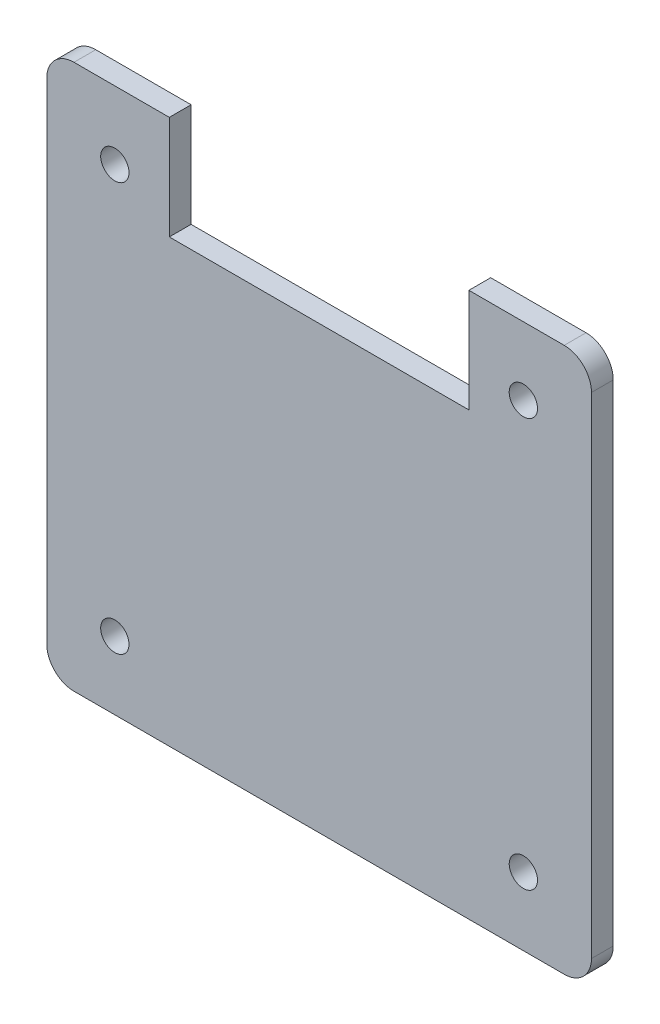
ISO-10303-21;
HEADER;
FILE_DESCRIPTION(('STEP AP214'),'2;1');
FILE_NAME('part.step','',(''),(''),'','','');
FILE_SCHEMA(('AUTOMOTIVE_DESIGN { 1 0 10303 214 1 1 1 1 }'));
ENDSEC;
DATA;
#1=APPLICATION_CONTEXT('core data for automotive mechanical design processes');
#2=APPLICATION_PROTOCOL_DEFINITION('international standard','automotive_design',2000,#1);
#3=PRODUCT_CONTEXT('',#1,'mechanical');
#4=PRODUCT('Part','Part','',(#3));
#5=PRODUCT_RELATED_PRODUCT_CATEGORY('part','',(#4));
#6=PRODUCT_DEFINITION_FORMATION('','',#4);
#7=PRODUCT_DEFINITION_CONTEXT('part definition',#1,'design');
#8=PRODUCT_DEFINITION('design','',#6,#7);
#9=PRODUCT_DEFINITION_SHAPE('','',#8);
#10=(LENGTH_UNIT() NAMED_UNIT(*) SI_UNIT(.MILLI.,.METRE.));
#11=(NAMED_UNIT(*) PLANE_ANGLE_UNIT() SI_UNIT($,.RADIAN.));
#12=(NAMED_UNIT(*) SI_UNIT($,.STERADIAN.) SOLID_ANGLE_UNIT());
#13=UNCERTAINTY_MEASURE_WITH_UNIT(LENGTH_MEASURE(1.E-05),#10,'distance_accuracy_value','');
#14=(GEOMETRIC_REPRESENTATION_CONTEXT(3) GLOBAL_UNCERTAINTY_ASSIGNED_CONTEXT((#13)) GLOBAL_UNIT_ASSIGNED_CONTEXT((#10,
#11,#12)) REPRESENTATION_CONTEXT('',''));
#15=CARTESIAN_POINT('',(0.,0.,0.));
#16=DIRECTION('',(0.,0.,1.));
#17=DIRECTION('',(1.,0.,0.));
#18=AXIS2_PLACEMENT_3D('',#15,#16,#17);
#19=CARTESIAN_POINT('',(50.,50.,4.));
#20=DIRECTION('',(0.,-1.,0.));
#21=DIRECTION('',(1.,0.,0.));
#22=AXIS2_PLACEMENT_3D('',#19,#20,#21);
#23=PLANE('',#22);
#24=DIRECTION('',(-1.,0.,0.));
#25=VECTOR('',#24,1.);
#26=CARTESIAN_POINT('',(50.,50.,0.));
#27=LINE('',#26,#25);
#28=CARTESIAN_POINT('',(45.,50.,0.));
#29=VERTEX_POINT('',#28);
#30=CARTESIAN_POINT('',(27.5,50.,0.));
#31=VERTEX_POINT('',#30);
#32=EDGE_CURVE('E182',#29,#31,#27,.T.);
#33=ORIENTED_EDGE('',*,*,#32,.T.);
#34=DIRECTION('',(0.,0.,1.));
#35=VECTOR('',#34,1.);
#36=CARTESIAN_POINT('',(27.5,50.,4.));
#37=LINE('',#36,#35);
#38=CARTESIAN_POINT('',(27.5,50.,4.));
#39=VERTEX_POINT('',#38);
#40=EDGE_CURVE('E151',#31,#39,#37,.T.);
#41=ORIENTED_EDGE('',*,*,#40,.T.);
#42=DIRECTION('',(-1.,0.,0.));
#43=VECTOR('',#42,1.);
#44=CARTESIAN_POINT('',(50.,50.,4.));
#45=LINE('',#44,#43);
#46=CARTESIAN_POINT('',(45.,50.,4.));
#47=VERTEX_POINT('',#46);
#48=EDGE_CURVE('E139',#47,#39,#45,.T.);
#49=ORIENTED_EDGE('',*,*,#48,.F.);
#50=DIRECTION('',(0.,0.,-1.));
#51=VECTOR('',#50,1.);
#52=CARTESIAN_POINT('',(45.,50.,4.));
#53=LINE('',#52,#51);
#54=EDGE_CURVE('E232',#47,#29,#53,.T.);
#55=ORIENTED_EDGE('',*,*,#54,.T.);
#56=EDGE_LOOP('',(#33,#41,#49,#55));
#57=FACE_BOUND('',#56,.T.);
#58=ADVANCED_FACE('F33',(#57),#23,.F.);
#59=CARTESIAN_POINT('',(-50.,-50.,4.));
#60=DIRECTION('',(1.,0.,0.));
#61=DIRECTION('',(0.,0.,-1.));
#62=AXIS2_PLACEMENT_3D('',#59,#60,#61);
#63=PLANE('',#62);
#64=DIRECTION('',(0.,-1.,0.));
#65=VECTOR('',#64,1.);
#66=CARTESIAN_POINT('',(-50.,-50.,0.));
#67=LINE('',#66,#65);
#68=CARTESIAN_POINT('',(-50.,45.,0.));
#69=VERTEX_POINT('',#68);
#70=CARTESIAN_POINT('',(-50.,-45.,0.));
#71=VERTEX_POINT('',#70);
#72=EDGE_CURVE('E175',#69,#71,#67,.T.);
#73=ORIENTED_EDGE('',*,*,#72,.T.);
#74=DIRECTION('',(0.,0.,-1.));
#75=VECTOR('',#74,1.);
#76=CARTESIAN_POINT('',(-50.,-45.,4.));
#77=LINE('',#76,#75);
#78=CARTESIAN_POINT('',(-50.,-45.,4.));
#79=VERTEX_POINT('',#78);
#80=EDGE_CURVE('E230',#71,#79,#77,.F.);
#81=ORIENTED_EDGE('',*,*,#80,.T.);
#82=DIRECTION('',(0.,-1.,0.));
#83=VECTOR('',#82,1.);
#84=CARTESIAN_POINT('',(-50.,-50.,4.));
#85=LINE('',#84,#83);
#86=CARTESIAN_POINT('',(-50.,45.,4.));
#87=VERTEX_POINT('',#86);
#88=EDGE_CURVE('E178',#87,#79,#85,.T.);
#89=ORIENTED_EDGE('',*,*,#88,.F.);
#90=DIRECTION('',(0.,0.,-1.));
#91=VECTOR('',#90,1.);
#92=CARTESIAN_POINT('',(-50.,45.,4.));
#93=LINE('',#92,#91);
#94=EDGE_CURVE('E227',#87,#69,#93,.T.);
#95=ORIENTED_EDGE('',*,*,#94,.T.);
#96=EDGE_LOOP('',(#73,#81,#89,#95));
#97=FACE_BOUND('',#96,.T.);
#98=ADVANCED_FACE('F245',(#97),#63,.F.);
#99=CARTESIAN_POINT('',(50.,-50.,4.));
#100=DIRECTION('',(0.,1.,0.));
#101=DIRECTION('',(-1.,0.,0.));
#102=AXIS2_PLACEMENT_3D('',#99,#100,#101);
#103=PLANE('',#102);
#104=DIRECTION('',(1.,0.,0.));
#105=VECTOR('',#104,1.);
#106=CARTESIAN_POINT('',(50.,-50.,0.));
#107=LINE('',#106,#105);
#108=CARTESIAN_POINT('',(-45.,-50.,0.));
#109=VERTEX_POINT('',#108);
#110=CARTESIAN_POINT('',(45.,-50.,0.));
#111=VERTEX_POINT('',#110);
#112=EDGE_CURVE('E192',#109,#111,#107,.T.);
#113=ORIENTED_EDGE('',*,*,#112,.T.);
#114=DIRECTION('',(0.,0.,-1.));
#115=VECTOR('',#114,1.);
#116=CARTESIAN_POINT('',(45.,-50.,4.));
#117=LINE('',#116,#115);
#118=CARTESIAN_POINT('',(45.,-50.,4.));
#119=VERTEX_POINT('',#118);
#120=EDGE_CURVE('E217',#111,#119,#117,.F.);
#121=ORIENTED_EDGE('',*,*,#120,.T.);
#122=DIRECTION('',(1.,0.,0.));
#123=VECTOR('',#122,1.);
#124=CARTESIAN_POINT('',(50.,-50.,4.));
#125=LINE('',#124,#123);
#126=CARTESIAN_POINT('',(-45.,-50.,4.));
#127=VERTEX_POINT('',#126);
#128=EDGE_CURVE('E181',#127,#119,#125,.T.);
#129=ORIENTED_EDGE('',*,*,#128,.F.);
#130=DIRECTION('',(0.,0.,-1.));
#131=VECTOR('',#130,1.);
#132=CARTESIAN_POINT('',(-45.,-50.,4.));
#133=LINE('',#132,#131);
#134=EDGE_CURVE('E214',#127,#109,#133,.T.);
#135=ORIENTED_EDGE('',*,*,#134,.T.);
#136=EDGE_LOOP('',(#113,#121,#129,#135));
#137=FACE_BOUND('',#136,.T.);
#138=ADVANCED_FACE('F254',(#137),#103,.F.);
#139=CARTESIAN_POINT('',(50.,-50.,4.));
#140=DIRECTION('',(-1.,0.,0.));
#141=DIRECTION('',(0.,0.,1.));
#142=AXIS2_PLACEMENT_3D('',#139,#140,#141);
#143=PLANE('',#142);
#144=DIRECTION('',(0.,1.,0.));
#145=VECTOR('',#144,1.);
#146=CARTESIAN_POINT('',(50.,-50.,4.));
#147=LINE('',#146,#145);
#148=CARTESIAN_POINT('',(50.,-45.,4.));
#149=VERTEX_POINT('',#148);
#150=CARTESIAN_POINT('',(50.,45.,4.));
#151=VERTEX_POINT('',#150);
#152=EDGE_CURVE('E185',#149,#151,#147,.T.);
#153=ORIENTED_EDGE('',*,*,#152,.F.);
#154=DIRECTION('',(0.,0.,-1.));
#155=VECTOR('',#154,1.);
#156=CARTESIAN_POINT('',(50.,-45.,4.));
#157=LINE('',#156,#155);
#158=CARTESIAN_POINT('',(50.,-45.,0.));
#159=VERTEX_POINT('',#158);
#160=EDGE_CURVE('E202',#149,#159,#157,.T.);
#161=ORIENTED_EDGE('',*,*,#160,.T.);
#162=DIRECTION('',(0.,1.,0.));
#163=VECTOR('',#162,1.);
#164=CARTESIAN_POINT('',(50.,-50.,0.));
#165=LINE('',#164,#163);
#166=CARTESIAN_POINT('',(50.,45.,0.));
#167=VERTEX_POINT('',#166);
#168=EDGE_CURVE('E195',#159,#167,#165,.T.);
#169=ORIENTED_EDGE('',*,*,#168,.T.);
#170=DIRECTION('',(0.,0.,-1.));
#171=VECTOR('',#170,1.);
#172=CARTESIAN_POINT('',(50.,45.,4.));
#173=LINE('',#172,#171);
#174=EDGE_CURVE('E189',#167,#151,#173,.F.);
#175=ORIENTED_EDGE('',*,*,#174,.T.);
#176=EDGE_LOOP('',(#153,#161,#169,#175));
#177=FACE_BOUND('',#176,.T.);
#178=ADVANCED_FACE('F263',(#177),#143,.F.);
#179=CARTESIAN_POINT('',(-27.5,50.,4.));
#180=VERTEX_POINT('',#179);
#181=CARTESIAN_POINT('',(-45.,50.,4.));
#182=VERTEX_POINT('',#181);
#183=EDGE_CURVE('E56',#180,#182,#45,.T.);
#184=ORIENTED_EDGE('',*,*,#183,.F.);
#185=DIRECTION('',(0.,0.,-1.));
#186=VECTOR('',#185,1.);
#187=CARTESIAN_POINT('',(-27.5,50.,4.));
#188=LINE('',#187,#186);
#189=CARTESIAN_POINT('',(-27.5,50.,0.));
#190=VERTEX_POINT('',#189);
#191=EDGE_CURVE('E147',#180,#190,#188,.T.);
#192=ORIENTED_EDGE('',*,*,#191,.T.);
#193=CARTESIAN_POINT('',(-45.,50.,0.));
#194=VERTEX_POINT('',#193);
#195=EDGE_CURVE('E198',#190,#194,#27,.T.);
#196=ORIENTED_EDGE('',*,*,#195,.T.);
#197=DIRECTION('',(0.,0.,-1.));
#198=VECTOR('',#197,1.);
#199=CARTESIAN_POINT('',(-45.,50.,4.));
#200=LINE('',#199,#198);
#201=EDGE_CURVE('E41',#194,#182,#200,.F.);
#202=ORIENTED_EDGE('',*,*,#201,.T.);
#203=EDGE_LOOP('',(#184,#192,#196,#202));
#204=FACE_BOUND('',#203,.T.);
#205=ADVANCED_FACE('F237',(#204),#23,.F.);
#206=CARTESIAN_POINT('',(0.,0.,4.));
#207=DIRECTION('',(0.,0.,1.));
#208=DIRECTION('',(1.,0.,0.));
#209=AXIS2_PLACEMENT_3D('',#206,#207,#208);
#210=PLANE('',#209);
#211=DIRECTION('',(0.,-1.,0.));
#212=VECTOR('',#211,1.);
#213=CARTESIAN_POINT('',(27.5,30.9820270755566,4.));
#214=LINE('',#213,#212);
#215=CARTESIAN_POINT('',(27.5,30.9820270755566,4.));
#216=VERTEX_POINT('',#215);
#217=EDGE_CURVE('E124',#39,#216,#214,.T.);
#218=ORIENTED_EDGE('',*,*,#217,.T.);
#219=DIRECTION('',(-1.,0.,0.));
#220=VECTOR('',#219,1.);
#221=CARTESIAN_POINT('',(-27.5,30.9820270755566,4.));
#222=LINE('',#221,#220);
#223=CARTESIAN_POINT('',(-27.5,30.9820270755566,4.));
#224=VERTEX_POINT('',#223);
#225=EDGE_CURVE('E131',#216,#224,#222,.T.);
#226=ORIENTED_EDGE('',*,*,#225,.T.);
#227=DIRECTION('',(0.,1.,0.));
#228=VECTOR('',#227,1.);
#229=CARTESIAN_POINT('',(-27.5,30.9820270755566,4.));
#230=LINE('',#229,#228);
#231=EDGE_CURVE('E128',#224,#180,#230,.T.);
#232=ORIENTED_EDGE('',*,*,#231,.T.);
#233=ORIENTED_EDGE('',*,*,#183,.T.);
#234=CARTESIAN_POINT('',(-45.,45.,4.));
#235=DIRECTION('',(0.,0.,1.));
#236=DIRECTION('',(1.,0.,0.));
#237=AXIS2_PLACEMENT_3D('',#234,#235,#236);
#238=CIRCLE('',#237,5.);
#239=EDGE_CURVE('E221',#182,#87,#238,.T.);
#240=ORIENTED_EDGE('',*,*,#239,.T.);
#241=ORIENTED_EDGE('',*,*,#88,.T.);
#242=CARTESIAN_POINT('',(-45.,-45.,4.));
#243=DIRECTION('',(0.,0.,1.));
#244=DIRECTION('',(1.,0.,0.));
#245=AXIS2_PLACEMENT_3D('',#242,#243,#244);
#246=CIRCLE('',#245,5.);
#247=EDGE_CURVE('E223',#79,#127,#246,.T.);
#248=ORIENTED_EDGE('',*,*,#247,.T.);
#249=ORIENTED_EDGE('',*,*,#128,.T.);
#250=CARTESIAN_POINT('',(45.,-45.,4.));
#251=DIRECTION('',(0.,0.,1.));
#252=DIRECTION('',(1.,0.,0.));
#253=AXIS2_PLACEMENT_3D('',#250,#251,#252);
#254=CIRCLE('',#253,5.);
#255=EDGE_CURVE('E225',#119,#149,#254,.T.);
#256=ORIENTED_EDGE('',*,*,#255,.T.);
#257=ORIENTED_EDGE('',*,*,#152,.T.);
#258=CARTESIAN_POINT('',(45.,45.,4.));
#259=DIRECTION('',(0.,0.,1.));
#260=DIRECTION('',(1.,0.,0.));
#261=AXIS2_PLACEMENT_3D('',#258,#259,#260);
#262=CIRCLE('',#261,5.);
#263=EDGE_CURVE('E219',#151,#47,#262,.T.);
#264=ORIENTED_EDGE('',*,*,#263,.T.);
#265=ORIENTED_EDGE('',*,*,#48,.T.);
#266=EDGE_LOOP('',(#218,#226,#232,#233,#240,#241,#248,#249,#256,#257,#264,#265));
#267=FACE_BOUND('',#266,.T.);
#268=CARTESIAN_POINT('',(37.5,37.5,4.));
#269=DIRECTION('',(0.,0.,1.));
#270=DIRECTION('',(1.,0.,0.));
#271=AXIS2_PLACEMENT_3D('',#268,#269,#270);
#272=CIRCLE('',#271,2.6);
#273=CARTESIAN_POINT('',(40.1,37.5,4.));
#274=VERTEX_POINT('',#273);
#275=EDGE_CURVE('E153',#274,#274,#272,.T.);
#276=ORIENTED_EDGE('',*,*,#275,.F.);
#277=EDGE_LOOP('',(#276));
#278=FACE_BOUND('',#277,.T.);
#279=CARTESIAN_POINT('',(37.5,-37.5,4.));
#280=DIRECTION('',(0.,0.,1.));
#281=DIRECTION('',(1.,0.,0.));
#282=AXIS2_PLACEMENT_3D('',#279,#280,#281);
#283=CIRCLE('',#282,2.6);
#284=CARTESIAN_POINT('',(40.1,-37.5,4.));
#285=VERTEX_POINT('',#284);
#286=EDGE_CURVE('E164',#285,#285,#283,.T.);
#287=ORIENTED_EDGE('',*,*,#286,.F.);
#288=EDGE_LOOP('',(#287));
#289=FACE_BOUND('',#288,.T.);
#290=CARTESIAN_POINT('',(-37.5,-37.5,4.));
#291=DIRECTION('',(0.,0.,1.));
#292=DIRECTION('',(1.,0.,0.));
#293=AXIS2_PLACEMENT_3D('',#290,#291,#292);
#294=CIRCLE('',#293,2.6);
#295=CARTESIAN_POINT('',(-34.9,-37.5,4.));
#296=VERTEX_POINT('',#295);
#297=EDGE_CURVE('E158',#296,#296,#294,.T.);
#298=ORIENTED_EDGE('',*,*,#297,.F.);
#299=EDGE_LOOP('',(#298));
#300=FACE_BOUND('',#299,.T.);
#301=CARTESIAN_POINT('',(-37.5,37.5,4.));
#302=DIRECTION('',(0.,0.,1.));
#303=DIRECTION('',(1.,0.,0.));
#304=AXIS2_PLACEMENT_3D('',#301,#302,#303);
#305=CIRCLE('',#304,2.6);
#306=CARTESIAN_POINT('',(-34.9,37.5,4.));
#307=VERTEX_POINT('',#306);
#308=EDGE_CURVE('E157',#307,#307,#305,.T.);
#309=ORIENTED_EDGE('',*,*,#308,.F.);
#310=EDGE_LOOP('',(#309));
#311=FACE_BOUND('',#310,.T.);
#312=ADVANCED_FACE('F136',(#267,#278,#289,#300,#311),#210,.T.);
#313=CARTESIAN_POINT('',(0.,0.,0.));
#314=DIRECTION('',(0.,0.,1.));
#315=DIRECTION('',(1.,0.,0.));
#316=AXIS2_PLACEMENT_3D('',#313,#314,#315);
#317=PLANE('',#316);
#318=CARTESIAN_POINT('',(37.5,37.5,0.));
#319=DIRECTION('',(0.,0.,1.));
#320=DIRECTION('',(1.,0.,0.));
#321=AXIS2_PLACEMENT_3D('',#318,#319,#320);
#322=CIRCLE('',#321,2.6);
#323=CARTESIAN_POINT('',(40.1,37.5,0.));
#324=VERTEX_POINT('',#323);
#325=EDGE_CURVE('E167',#324,#324,#322,.T.);
#326=ORIENTED_EDGE('',*,*,#325,.T.);
#327=EDGE_LOOP('',(#326));
#328=FACE_BOUND('',#327,.T.);
#329=CARTESIAN_POINT('',(37.5,-37.5,0.));
#330=DIRECTION('',(0.,0.,1.));
#331=DIRECTION('',(1.,0.,0.));
#332=AXIS2_PLACEMENT_3D('',#329,#330,#331);
#333=CIRCLE('',#332,2.6);
#334=CARTESIAN_POINT('',(40.1,-37.5,0.));
#335=VERTEX_POINT('',#334);
#336=EDGE_CURVE('E161',#335,#335,#333,.T.);
#337=ORIENTED_EDGE('',*,*,#336,.T.);
#338=EDGE_LOOP('',(#337));
#339=FACE_BOUND('',#338,.T.);
#340=CARTESIAN_POINT('',(-37.5,-37.5,0.));
#341=DIRECTION('',(0.,0.,1.));
#342=DIRECTION('',(1.,0.,0.));
#343=AXIS2_PLACEMENT_3D('',#340,#341,#342);
#344=CIRCLE('',#343,2.6);
#345=CARTESIAN_POINT('',(-34.9,-37.5,0.));
#346=VERTEX_POINT('',#345);
#347=EDGE_CURVE('E154',#346,#346,#344,.T.);
#348=ORIENTED_EDGE('',*,*,#347,.T.);
#349=EDGE_LOOP('',(#348));
#350=FACE_BOUND('',#349,.T.);
#351=CARTESIAN_POINT('',(-37.5,37.5,0.));
#352=DIRECTION('',(0.,0.,1.));
#353=DIRECTION('',(1.,0.,0.));
#354=AXIS2_PLACEMENT_3D('',#351,#352,#353);
#355=CIRCLE('',#354,2.6);
#356=CARTESIAN_POINT('',(-34.9,37.5,0.));
#357=VERTEX_POINT('',#356);
#358=EDGE_CURVE('E172',#357,#357,#355,.T.);
#359=ORIENTED_EDGE('',*,*,#358,.T.);
#360=EDGE_LOOP('',(#359));
#361=FACE_BOUND('',#360,.T.);
#362=DIRECTION('',(-1.,0.,0.));
#363=VECTOR('',#362,1.);
#364=CARTESIAN_POINT('',(-27.5,30.9820270755566,0.));
#365=LINE('',#364,#363);
#366=CARTESIAN_POINT('',(27.5,30.9820270755566,0.));
#367=VERTEX_POINT('',#366);
#368=CARTESIAN_POINT('',(-27.5,30.9820270755566,0.));
#369=VERTEX_POINT('',#368);
#370=EDGE_CURVE('E142',#367,#369,#365,.T.);
#371=ORIENTED_EDGE('',*,*,#370,.F.);
#372=DIRECTION('',(0.,1.,0.));
#373=VECTOR('',#372,1.);
#374=CARTESIAN_POINT('',(27.5,0.,0.));
#375=LINE('',#374,#373);
#376=EDGE_CURVE('E11',#367,#31,#375,.T.);
#377=ORIENTED_EDGE('',*,*,#376,.T.);
#378=ORIENTED_EDGE('',*,*,#32,.F.);
#379=CARTESIAN_POINT('',(45.,45.,0.));
#380=DIRECTION('',(0.,0.,1.));
#381=DIRECTION('',(1.,0.,0.));
#382=AXIS2_PLACEMENT_3D('',#379,#380,#381);
#383=CIRCLE('',#382,5.);
#384=EDGE_CURVE('E205',#29,#167,#383,.F.);
#385=ORIENTED_EDGE('',*,*,#384,.T.);
#386=ORIENTED_EDGE('',*,*,#168,.F.);
#387=CARTESIAN_POINT('',(45.,-45.,0.));
#388=DIRECTION('',(0.,0.,1.));
#389=DIRECTION('',(1.,0.,0.));
#390=AXIS2_PLACEMENT_3D('',#387,#388,#389);
#391=CIRCLE('',#390,5.);
#392=EDGE_CURVE('E212',#159,#111,#391,.F.);
#393=ORIENTED_EDGE('',*,*,#392,.T.);
#394=ORIENTED_EDGE('',*,*,#112,.F.);
#395=CARTESIAN_POINT('',(-45.,-45.,0.));
#396=DIRECTION('',(0.,0.,1.));
#397=DIRECTION('',(1.,0.,0.));
#398=AXIS2_PLACEMENT_3D('',#395,#396,#397);
#399=CIRCLE('',#398,5.);
#400=EDGE_CURVE('E210',#109,#71,#399,.F.);
#401=ORIENTED_EDGE('',*,*,#400,.T.);
#402=ORIENTED_EDGE('',*,*,#72,.F.);
#403=CARTESIAN_POINT('',(-45.,45.,0.));
#404=DIRECTION('',(0.,0.,1.));
#405=DIRECTION('',(1.,0.,0.));
#406=AXIS2_PLACEMENT_3D('',#403,#404,#405);
#407=CIRCLE('',#406,5.);
#408=EDGE_CURVE('E207',#69,#194,#407,.F.);
#409=ORIENTED_EDGE('',*,*,#408,.T.);
#410=ORIENTED_EDGE('',*,*,#195,.F.);
#411=DIRECTION('',(0.,1.,0.));
#412=VECTOR('',#411,1.);
#413=CARTESIAN_POINT('',(-27.5,30.9820270755566,0.));
#414=LINE('',#413,#412);
#415=EDGE_CURVE('E140',#369,#190,#414,.T.);
#416=ORIENTED_EDGE('',*,*,#415,.F.);
#417=EDGE_LOOP('',(#371,#377,#378,#385,#386,#393,#394,#401,#402,#409,#410,#416));
#418=FACE_BOUND('',#417,.T.);
#419=ADVANCED_FACE('F271',(#328,#339,#350,#361,#418),#317,.F.);
#420=CARTESIAN_POINT('',(-37.5,37.5,0.));
#421=DIRECTION('',(0.,0.,1.));
#422=DIRECTION('',(1.,0.,0.));
#423=AXIS2_PLACEMENT_3D('',#420,#421,#422);
#424=CYLINDRICAL_SURFACE('',#423,2.6);
#425=ORIENTED_EDGE('',*,*,#358,.F.);
#426=EDGE_LOOP('',(#425));
#427=FACE_BOUND('',#426,.T.);
#428=ORIENTED_EDGE('',*,*,#308,.T.);
#429=EDGE_LOOP('',(#428));
#430=FACE_BOUND('',#429,.T.);
#431=ADVANCED_FACE('F337',(#427,#430),#424,.F.);
#432=CARTESIAN_POINT('',(-37.5,-37.5,0.));
#433=DIRECTION('',(0.,0.,1.));
#434=DIRECTION('',(1.,0.,0.));
#435=AXIS2_PLACEMENT_3D('',#432,#433,#434);
#436=CYLINDRICAL_SURFACE('',#435,2.6);
#437=ORIENTED_EDGE('',*,*,#347,.F.);
#438=EDGE_LOOP('',(#437));
#439=FACE_BOUND('',#438,.T.);
#440=ORIENTED_EDGE('',*,*,#297,.T.);
#441=EDGE_LOOP('',(#440));
#442=FACE_BOUND('',#441,.T.);
#443=ADVANCED_FACE('F384',(#439,#442),#436,.F.);
#444=CARTESIAN_POINT('',(37.5,-37.5,0.));
#445=DIRECTION('',(0.,0.,1.));
#446=DIRECTION('',(1.,0.,0.));
#447=AXIS2_PLACEMENT_3D('',#444,#445,#446);
#448=CYLINDRICAL_SURFACE('',#447,2.6);
#449=ORIENTED_EDGE('',*,*,#336,.F.);
#450=EDGE_LOOP('',(#449));
#451=FACE_BOUND('',#450,.T.);
#452=ORIENTED_EDGE('',*,*,#286,.T.);
#453=EDGE_LOOP('',(#452));
#454=FACE_BOUND('',#453,.T.);
#455=ADVANCED_FACE('F373',(#451,#454),#448,.F.);
#456=CARTESIAN_POINT('',(37.5,37.5,0.));
#457=DIRECTION('',(0.,0.,1.));
#458=DIRECTION('',(1.,0.,0.));
#459=AXIS2_PLACEMENT_3D('',#456,#457,#458);
#460=CYLINDRICAL_SURFACE('',#459,2.6);
#461=ORIENTED_EDGE('',*,*,#325,.F.);
#462=EDGE_LOOP('',(#461));
#463=FACE_BOUND('',#462,.T.);
#464=ORIENTED_EDGE('',*,*,#275,.T.);
#465=EDGE_LOOP('',(#464));
#466=FACE_BOUND('',#465,.T.);
#467=ADVANCED_FACE('F305',(#463,#466),#460,.F.);
#468=CARTESIAN_POINT('',(45.,-45.,4.));
#469=DIRECTION('',(0.,0.,-1.));
#470=DIRECTION('',(-1.,0.,0.));
#471=AXIS2_PLACEMENT_3D('',#468,#469,#470);
#472=CYLINDRICAL_SURFACE('',#471,5.);
#473=ORIENTED_EDGE('',*,*,#255,.F.);
#474=ORIENTED_EDGE('',*,*,#120,.F.);
#475=ORIENTED_EDGE('',*,*,#392,.F.);
#476=ORIENTED_EDGE('',*,*,#160,.F.);
#477=EDGE_LOOP('',(#473,#474,#475,#476));
#478=FACE_BOUND('',#477,.T.);
#479=ADVANCED_FACE('F258',(#478),#472,.T.);
#480=CARTESIAN_POINT('',(-45.,-45.,4.));
#481=DIRECTION('',(0.,0.,-1.));
#482=DIRECTION('',(-1.,0.,0.));
#483=AXIS2_PLACEMENT_3D('',#480,#481,#482);
#484=CYLINDRICAL_SURFACE('',#483,5.);
#485=ORIENTED_EDGE('',*,*,#247,.F.);
#486=ORIENTED_EDGE('',*,*,#80,.F.);
#487=ORIENTED_EDGE('',*,*,#400,.F.);
#488=ORIENTED_EDGE('',*,*,#134,.F.);
#489=EDGE_LOOP('',(#485,#486,#487,#488));
#490=FACE_BOUND('',#489,.T.);
#491=ADVANCED_FACE('F249',(#490),#484,.T.);
#492=CARTESIAN_POINT('',(-45.,45.,4.));
#493=DIRECTION('',(0.,0.,-1.));
#494=DIRECTION('',(-1.,0.,0.));
#495=AXIS2_PLACEMENT_3D('',#492,#493,#494);
#496=CYLINDRICAL_SURFACE('',#495,5.);
#497=ORIENTED_EDGE('',*,*,#239,.F.);
#498=ORIENTED_EDGE('',*,*,#201,.F.);
#499=ORIENTED_EDGE('',*,*,#408,.F.);
#500=ORIENTED_EDGE('',*,*,#94,.F.);
#501=EDGE_LOOP('',(#497,#498,#499,#500));
#502=FACE_BOUND('',#501,.T.);
#503=ADVANCED_FACE('F241',(#502),#496,.T.);
#504=CARTESIAN_POINT('',(45.,45.,4.));
#505=DIRECTION('',(0.,0.,-1.));
#506=DIRECTION('',(-1.,0.,0.));
#507=AXIS2_PLACEMENT_3D('',#504,#505,#506);
#508=CYLINDRICAL_SURFACE('',#507,5.);
#509=ORIENTED_EDGE('',*,*,#263,.F.);
#510=ORIENTED_EDGE('',*,*,#174,.F.);
#511=ORIENTED_EDGE('',*,*,#384,.F.);
#512=ORIENTED_EDGE('',*,*,#54,.F.);
#513=EDGE_LOOP('',(#509,#510,#511,#512));
#514=FACE_BOUND('',#513,.T.);
#515=ADVANCED_FACE('F35',(#514),#508,.T.);
#516=CARTESIAN_POINT('',(27.5,30.9820270755566,4.));
#517=DIRECTION('',(1.,0.,0.));
#518=DIRECTION('',(0.,0.,-1.));
#519=AXIS2_PLACEMENT_3D('',#516,#517,#518);
#520=PLANE('',#519);
#521=ORIENTED_EDGE('',*,*,#376,.F.);
#522=DIRECTION('',(0.,0.,-1.));
#523=VECTOR('',#522,1.);
#524=CARTESIAN_POINT('',(27.5,30.9820270755566,4.));
#525=LINE('',#524,#523);
#526=EDGE_CURVE('E48',#216,#367,#525,.T.);
#527=ORIENTED_EDGE('',*,*,#526,.F.);
#528=ORIENTED_EDGE('',*,*,#217,.F.);
#529=ORIENTED_EDGE('',*,*,#40,.F.);
#530=EDGE_LOOP('',(#521,#527,#528,#529));
#531=FACE_BOUND('',#530,.T.);
#532=ADVANCED_FACE('F122',(#531),#520,.F.);
#533=CARTESIAN_POINT('',(-27.5,30.9820270755566,4.));
#534=DIRECTION('',(-1.,0.,0.));
#535=DIRECTION('',(0.,0.,1.));
#536=AXIS2_PLACEMENT_3D('',#533,#534,#535);
#537=PLANE('',#536);
#538=ORIENTED_EDGE('',*,*,#231,.F.);
#539=DIRECTION('',(0.,0.,-1.));
#540=VECTOR('',#539,1.);
#541=CARTESIAN_POINT('',(-27.5,30.9820270755566,4.));
#542=LINE('',#541,#540);
#543=EDGE_CURVE('E127',#224,#369,#542,.T.);
#544=ORIENTED_EDGE('',*,*,#543,.T.);
#545=ORIENTED_EDGE('',*,*,#415,.T.);
#546=ORIENTED_EDGE('',*,*,#191,.F.);
#547=EDGE_LOOP('',(#538,#544,#545,#546));
#548=FACE_BOUND('',#547,.T.);
#549=ADVANCED_FACE('F274',(#548),#537,.F.);
#550=CARTESIAN_POINT('',(-27.5,30.9820270755566,4.));
#551=DIRECTION('',(0.,-1.,0.));
#552=DIRECTION('',(1.,0.,0.));
#553=AXIS2_PLACEMENT_3D('',#550,#551,#552);
#554=PLANE('',#553);
#555=ORIENTED_EDGE('',*,*,#370,.T.);
#556=ORIENTED_EDGE('',*,*,#543,.F.);
#557=ORIENTED_EDGE('',*,*,#225,.F.);
#558=ORIENTED_EDGE('',*,*,#526,.T.);
#559=EDGE_LOOP('',(#555,#556,#557,#558));
#560=FACE_BOUND('',#559,.T.);
#561=ADVANCED_FACE('F132',(#560),#554,.F.);
#562=CLOSED_SHELL('',(#58,#98,#138,#178,#205,#312,#419,#431,#443,#455,#467,#479,#491,#503,#515,
#532,#549,#561));
#563=MANIFOLD_SOLID_BREP('B2',#562);
#564=ADVANCED_BREP_SHAPE_REPRESENTATION('',(#18,#563),#14);
#565=SHAPE_DEFINITION_REPRESENTATION(#9,#564);
ENDSEC;
END-ISO-10303-21;
